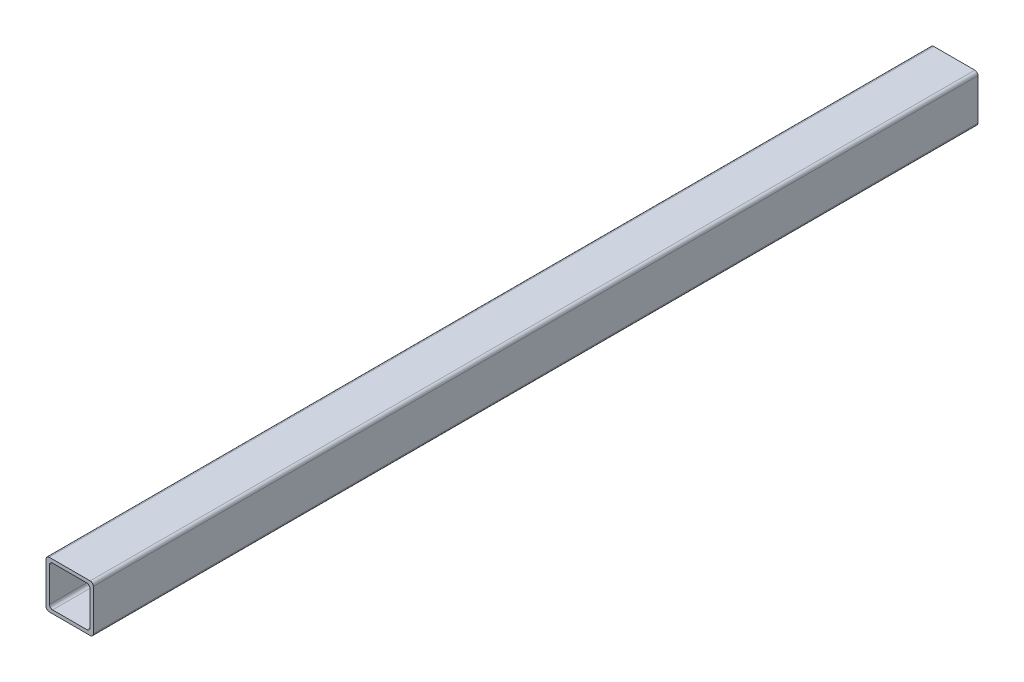
ISO-10303-21;
HEADER;
FILE_DESCRIPTION(('STEP AP214'),'2;1');
FILE_NAME('part.step','',(''),(''),'','','');
FILE_SCHEMA(('AUTOMOTIVE_DESIGN { 1 0 10303 214 1 1 1 1 }'));
ENDSEC;
DATA;
#1=APPLICATION_CONTEXT('core data for automotive mechanical design processes');
#2=APPLICATION_PROTOCOL_DEFINITION('international standard','automotive_design',2000,#1);
#3=PRODUCT_CONTEXT('',#1,'mechanical');
#4=PRODUCT('Part','Part','',(#3));
#5=PRODUCT_RELATED_PRODUCT_CATEGORY('part','',(#4));
#6=PRODUCT_DEFINITION_FORMATION('','',#4);
#7=PRODUCT_DEFINITION_CONTEXT('part definition',#1,'design');
#8=PRODUCT_DEFINITION('design','',#6,#7);
#9=PRODUCT_DEFINITION_SHAPE('','',#8);
#10=(LENGTH_UNIT() NAMED_UNIT(*) SI_UNIT(.MILLI.,.METRE.));
#11=(NAMED_UNIT(*) PLANE_ANGLE_UNIT() SI_UNIT($,.RADIAN.));
#12=(NAMED_UNIT(*) SI_UNIT($,.STERADIAN.) SOLID_ANGLE_UNIT());
#13=UNCERTAINTY_MEASURE_WITH_UNIT(LENGTH_MEASURE(1.E-05),#10,'distance_accuracy_value','');
#14=(GEOMETRIC_REPRESENTATION_CONTEXT(3) GLOBAL_UNCERTAINTY_ASSIGNED_CONTEXT((#13)) GLOBAL_UNIT_ASSIGNED_CONTEXT((#10,
#11,#12)) REPRESENTATION_CONTEXT('',''));
#15=CARTESIAN_POINT('',(0.,0.,0.));
#16=DIRECTION('',(0.,0.,1.));
#17=DIRECTION('',(1.,0.,0.));
#18=AXIS2_PLACEMENT_3D('',#15,#16,#17);
#19=CARTESIAN_POINT('',(2.54,-35.56,0.));
#20=DIRECTION('',(0.,0.,1.));
#21=DIRECTION('',(1.,0.,0.));
#22=AXIS2_PLACEMENT_3D('',#19,#20,#21);
#23=PLANE('',#22);
#24=CARTESIAN_POINT('',(2.54,-35.56,0.));
#25=DIRECTION('',(0.,0.,1.));
#26=DIRECTION('',(1.,0.,0.));
#27=AXIS2_PLACEMENT_3D('',#24,#25,#26);
#28=CIRCLE('',#27,2.54);
#29=CARTESIAN_POINT('',(0.,-35.56,0.));
#30=VERTEX_POINT('',#29);
#31=CARTESIAN_POINT('',(2.54000000000002,-38.1,0.));
#32=VERTEX_POINT('',#31);
#33=EDGE_CURVE('E193',#30,#32,#28,.T.);
#34=ORIENTED_EDGE('',*,*,#33,.F.);
#35=DIRECTION('',(0.,-1.,0.));
#36=VECTOR('',#35,1.);
#37=CARTESIAN_POINT('',(0.,-2.54000000000002,0.));
#38=LINE('',#37,#36);
#39=CARTESIAN_POINT('',(0.,-2.54000000000002,0.));
#40=VERTEX_POINT('',#39);
#41=EDGE_CURVE('E217',#40,#30,#38,.T.);
#42=ORIENTED_EDGE('',*,*,#41,.F.);
#43=CARTESIAN_POINT('',(2.54,-2.54,0.));
#44=DIRECTION('',(0.,0.,1.));
#45=DIRECTION('',(-1.,0.,0.));
#46=AXIS2_PLACEMENT_3D('',#43,#44,#45);
#47=CIRCLE('',#46,2.54);
#48=CARTESIAN_POINT('',(2.54000000000002,0.,0.));
#49=VERTEX_POINT('',#48);
#50=EDGE_CURVE('E214',#49,#40,#47,.T.);
#51=ORIENTED_EDGE('',*,*,#50,.F.);
#52=DIRECTION('',(-1.,0.,0.));
#53=VECTOR('',#52,1.);
#54=CARTESIAN_POINT('',(2.54000000000002,0.,0.));
#55=LINE('',#54,#53);
#56=CARTESIAN_POINT('',(35.56,0.,0.));
#57=VERTEX_POINT('',#56);
#58=EDGE_CURVE('E212',#57,#49,#55,.T.);
#59=ORIENTED_EDGE('',*,*,#58,.F.);
#60=CARTESIAN_POINT('',(35.56,-2.54,0.));
#61=DIRECTION('',(0.,0.,1.));
#62=DIRECTION('',(1.,0.,0.));
#63=AXIS2_PLACEMENT_3D('',#60,#61,#62);
#64=CIRCLE('',#63,2.54);
#65=CARTESIAN_POINT('',(38.1,-2.54000000000002,0.));
#66=VERTEX_POINT('',#65);
#67=EDGE_CURVE('E165',#66,#57,#64,.T.);
#68=ORIENTED_EDGE('',*,*,#67,.F.);
#69=DIRECTION('',(0.,1.,0.));
#70=VECTOR('',#69,1.);
#71=CARTESIAN_POINT('',(38.1,-2.54000000000002,0.));
#72=LINE('',#71,#70);
#73=CARTESIAN_POINT('',(38.1,-35.56,0.));
#74=VERTEX_POINT('',#73);
#75=EDGE_CURVE('E208',#74,#66,#72,.T.);
#76=ORIENTED_EDGE('',*,*,#75,.F.);
#77=CARTESIAN_POINT('',(35.56,-35.56,0.));
#78=DIRECTION('',(0.,0.,1.));
#79=DIRECTION('',(-1.,0.,0.));
#80=AXIS2_PLACEMENT_3D('',#77,#78,#79);
#81=CIRCLE('',#80,2.54);
#82=CARTESIAN_POINT('',(35.56,-38.1,0.));
#83=VERTEX_POINT('',#82);
#84=EDGE_CURVE('E196',#83,#74,#81,.T.);
#85=ORIENTED_EDGE('',*,*,#84,.F.);
#86=DIRECTION('',(1.,0.,0.));
#87=VECTOR('',#86,1.);
#88=CARTESIAN_POINT('',(2.54000000000002,-38.1,0.));
#89=LINE('',#88,#87);
#90=EDGE_CURVE('E184',#32,#83,#89,.T.);
#91=ORIENTED_EDGE('',*,*,#90,.F.);
#92=EDGE_LOOP('',(#34,#42,#51,#59,#68,#76,#85,#91));
#93=FACE_BOUND('',#92,.T.);
#94=CARTESIAN_POINT('',(5.3086,-32.7914,0.));
#95=DIRECTION('',(0.,0.,1.));
#96=DIRECTION('',(1.,0.,0.));
#97=AXIS2_PLACEMENT_3D('',#94,#95,#96);
#98=CIRCLE('',#97,2.54);
#99=CARTESIAN_POINT('',(2.7686,-32.7914,0.));
#100=VERTEX_POINT('',#99);
#101=CARTESIAN_POINT('',(5.30860000000002,-35.3314,0.));
#102=VERTEX_POINT('',#101);
#103=EDGE_CURVE('E234',#100,#102,#98,.T.);
#104=ORIENTED_EDGE('',*,*,#103,.T.);
#105=DIRECTION('',(1.,0.,0.));
#106=VECTOR('',#105,1.);
#107=CARTESIAN_POINT('',(5.30860000000002,-35.3314,0.));
#108=LINE('',#107,#106);
#109=CARTESIAN_POINT('',(32.7914,-35.3314,0.));
#110=VERTEX_POINT('',#109);
#111=EDGE_CURVE('E240',#102,#110,#108,.T.);
#112=ORIENTED_EDGE('',*,*,#111,.T.);
#113=CARTESIAN_POINT('',(32.7914,-32.7914,0.));
#114=DIRECTION('',(0.,0.,1.));
#115=DIRECTION('',(1.,0.,0.));
#116=AXIS2_PLACEMENT_3D('',#113,#114,#115);
#117=CIRCLE('',#116,2.54);
#118=CARTESIAN_POINT('',(35.3314,-32.7914,0.));
#119=VERTEX_POINT('',#118);
#120=EDGE_CURVE('E243',#110,#119,#117,.T.);
#121=ORIENTED_EDGE('',*,*,#120,.T.);
#122=DIRECTION('',(0.,1.,0.));
#123=VECTOR('',#122,1.);
#124=CARTESIAN_POINT('',(35.3314,-5.30860000000002,0.));
#125=LINE('',#124,#123);
#126=CARTESIAN_POINT('',(35.3314,-5.30860000000002,0.));
#127=VERTEX_POINT('',#126);
#128=EDGE_CURVE('E246',#119,#127,#125,.T.);
#129=ORIENTED_EDGE('',*,*,#128,.T.);
#130=CARTESIAN_POINT('',(32.7914,-5.3086,0.));
#131=DIRECTION('',(0.,0.,1.));
#132=DIRECTION('',(1.,0.,0.));
#133=AXIS2_PLACEMENT_3D('',#130,#131,#132);
#134=CIRCLE('',#133,2.54);
#135=CARTESIAN_POINT('',(32.7914,-2.7686,0.));
#136=VERTEX_POINT('',#135);
#137=EDGE_CURVE('E249',#127,#136,#134,.T.);
#138=ORIENTED_EDGE('',*,*,#137,.T.);
#139=DIRECTION('',(-1.,0.,0.));
#140=VECTOR('',#139,1.);
#141=CARTESIAN_POINT('',(5.30860000000002,-2.7686,0.));
#142=LINE('',#141,#140);
#143=CARTESIAN_POINT('',(5.30860000000002,-2.7686,0.));
#144=VERTEX_POINT('',#143);
#145=EDGE_CURVE('E252',#136,#144,#142,.T.);
#146=ORIENTED_EDGE('',*,*,#145,.T.);
#147=CARTESIAN_POINT('',(5.3086,-5.3086,0.));
#148=DIRECTION('',(0.,0.,1.));
#149=DIRECTION('',(1.,0.,0.));
#150=AXIS2_PLACEMENT_3D('',#147,#148,#149);
#151=CIRCLE('',#150,2.54);
#152=CARTESIAN_POINT('',(2.7686,-5.30860000000002,0.));
#153=VERTEX_POINT('',#152);
#154=EDGE_CURVE('E255',#144,#153,#151,.T.);
#155=ORIENTED_EDGE('',*,*,#154,.T.);
#156=DIRECTION('',(0.,-1.,0.));
#157=VECTOR('',#156,1.);
#158=CARTESIAN_POINT('',(2.7686,-5.30860000000002,0.));
#159=LINE('',#158,#157);
#160=EDGE_CURVE('E258',#153,#100,#159,.T.);
#161=ORIENTED_EDGE('',*,*,#160,.T.);
#162=EDGE_LOOP('',(#104,#112,#121,#129,#138,#146,#155,#161));
#163=FACE_BOUND('',#162,.T.);
#164=ADVANCED_FACE('F33',(#93,#163),#23,.F.);
#165=CARTESIAN_POINT('',(2.54,-35.56,737.));
#166=DIRECTION('',(0.,0.,-1.));
#167=DIRECTION('',(-1.,0.,0.));
#168=AXIS2_PLACEMENT_3D('',#165,#166,#167);
#169=CYLINDRICAL_SURFACE('',#168,2.54);
#170=DIRECTION('',(0.,0.,-1.));
#171=VECTOR('',#170,1.);
#172=CARTESIAN_POINT('',(2.54000000000002,-38.1,737.));
#173=LINE('',#172,#171);
#174=CARTESIAN_POINT('',(2.54000000000002,-38.1,711.899999999977));
#175=VERTEX_POINT('',#174);
#176=EDGE_CURVE('E41',#175,#32,#173,.T.);
#177=ORIENTED_EDGE('',*,*,#176,.F.);
#178=CARTESIAN_POINT('',(2.54,-35.56,711.899999999977));
#179=DIRECTION('',(0.,0.,-1.));
#180=DIRECTION('',(-1.,0.,0.));
#181=AXIS2_PLACEMENT_3D('',#178,#179,#180);
#182=CIRCLE('',#181,2.54);
#183=CARTESIAN_POINT('',(0.,-35.56,711.899999999977));
#184=VERTEX_POINT('',#183);
#185=EDGE_CURVE('E232',#175,#184,#182,.T.);
#186=ORIENTED_EDGE('',*,*,#185,.T.);
#187=DIRECTION('',(0.,0.,-1.));
#188=VECTOR('',#187,1.);
#189=CARTESIAN_POINT('',(0.,-35.56,737.));
#190=LINE('',#189,#188);
#191=EDGE_CURVE('E199',#184,#30,#190,.T.);
#192=ORIENTED_EDGE('',*,*,#191,.T.);
#193=ORIENTED_EDGE('',*,*,#33,.T.);
#194=EDGE_LOOP('',(#177,#186,#192,#193));
#195=FACE_BOUND('',#194,.T.);
#196=ADVANCED_FACE('F35',(#195),#169,.T.);
#197=CARTESIAN_POINT('',(2.54000000000002,-38.1,737.));
#198=DIRECTION('',(0.,1.,0.));
#199=DIRECTION('',(0.,0.,1.));
#200=AXIS2_PLACEMENT_3D('',#197,#198,#199);
#201=PLANE('',#200);
#202=DIRECTION('',(0.,0.,-1.));
#203=VECTOR('',#202,1.);
#204=CARTESIAN_POINT('',(35.56,-38.1,737.));
#205=LINE('',#204,#203);
#206=CARTESIAN_POINT('',(35.56,-38.1,711.899999999977));
#207=VERTEX_POINT('',#206);
#208=EDGE_CURVE('E176',#207,#83,#205,.T.);
#209=ORIENTED_EDGE('',*,*,#208,.F.);
#210=DIRECTION('',(-1.,0.,0.));
#211=VECTOR('',#210,1.);
#212=CARTESIAN_POINT('',(0.,-38.1,711.899999999977));
#213=LINE('',#212,#211);
#214=EDGE_CURVE('E161',#207,#175,#213,.T.);
#215=ORIENTED_EDGE('',*,*,#214,.T.);
#216=ORIENTED_EDGE('',*,*,#176,.T.);
#217=ORIENTED_EDGE('',*,*,#90,.T.);
#218=EDGE_LOOP('',(#209,#215,#216,#217));
#219=FACE_BOUND('',#218,.T.);
#220=ADVANCED_FACE('F183',(#219),#201,.F.);
#221=CARTESIAN_POINT('',(35.56,-35.56,737.));
#222=DIRECTION('',(0.,0.,-1.));
#223=DIRECTION('',(-1.,0.,0.));
#224=AXIS2_PLACEMENT_3D('',#221,#222,#223);
#225=CYLINDRICAL_SURFACE('',#224,2.54);
#226=DIRECTION('',(0.,0.,-1.));
#227=VECTOR('',#226,1.);
#228=CARTESIAN_POINT('',(38.1,-35.56,737.));
#229=LINE('',#228,#227);
#230=CARTESIAN_POINT('',(38.1,-35.56,711.899999999977));
#231=VERTEX_POINT('',#230);
#232=EDGE_CURVE('E169',#231,#74,#229,.T.);
#233=ORIENTED_EDGE('',*,*,#232,.F.);
#234=CARTESIAN_POINT('',(35.56,-35.56,711.899999999977));
#235=DIRECTION('',(0.,0.,-1.));
#236=DIRECTION('',(-1.,0.,0.));
#237=AXIS2_PLACEMENT_3D('',#234,#235,#236);
#238=CIRCLE('',#237,2.54);
#239=EDGE_CURVE('E152',#231,#207,#238,.T.);
#240=ORIENTED_EDGE('',*,*,#239,.T.);
#241=ORIENTED_EDGE('',*,*,#208,.T.);
#242=ORIENTED_EDGE('',*,*,#84,.T.);
#243=EDGE_LOOP('',(#233,#240,#241,#242));
#244=FACE_BOUND('',#243,.T.);
#245=ADVANCED_FACE('F231',(#244),#225,.T.);
#246=CARTESIAN_POINT('',(38.1,-2.54000000000002,737.));
#247=DIRECTION('',(-1.,0.,0.));
#248=DIRECTION('',(0.,-1.,0.));
#249=AXIS2_PLACEMENT_3D('',#246,#247,#248);
#250=PLANE('',#249);
#251=DIRECTION('',(0.,0.,-1.));
#252=VECTOR('',#251,1.);
#253=CARTESIAN_POINT('',(38.1,-2.54000000000002,737.));
#254=LINE('',#253,#252);
#255=CARTESIAN_POINT('',(38.1,-2.54000000000001,711.899999999977));
#256=VERTEX_POINT('',#255);
#257=EDGE_CURVE('E167',#256,#66,#254,.T.);
#258=ORIENTED_EDGE('',*,*,#257,.F.);
#259=DIRECTION('',(0.,1.,0.));
#260=VECTOR('',#259,1.);
#261=CARTESIAN_POINT('',(38.1,-38.1,711.899999999977));
#262=LINE('',#261,#260);
#263=EDGE_CURVE('E148',#231,#256,#262,.T.);
#264=ORIENTED_EDGE('',*,*,#263,.F.);
#265=ORIENTED_EDGE('',*,*,#232,.T.);
#266=ORIENTED_EDGE('',*,*,#75,.T.);
#267=EDGE_LOOP('',(#258,#264,#265,#266));
#268=FACE_BOUND('',#267,.T.);
#269=ADVANCED_FACE('F227',(#268),#250,.F.);
#270=CARTESIAN_POINT('',(35.56,-2.54,737.));
#271=DIRECTION('',(0.,0.,-1.));
#272=DIRECTION('',(-1.,0.,0.));
#273=AXIS2_PLACEMENT_3D('',#270,#271,#272);
#274=CYLINDRICAL_SURFACE('',#273,2.54);
#275=DIRECTION('',(0.,0.,-1.));
#276=VECTOR('',#275,1.);
#277=CARTESIAN_POINT('',(35.56,0.,737.));
#278=LINE('',#277,#276);
#279=CARTESIAN_POINT('',(35.56,0.,711.899999999977));
#280=VERTEX_POINT('',#279);
#281=EDGE_CURVE('E158',#280,#57,#278,.T.);
#282=ORIENTED_EDGE('',*,*,#281,.F.);
#283=CARTESIAN_POINT('',(35.56,-2.54,711.899999999977));
#284=DIRECTION('',(0.,0.,-1.));
#285=DIRECTION('',(-1.,0.,0.));
#286=AXIS2_PLACEMENT_3D('',#283,#284,#285);
#287=CIRCLE('',#286,2.54);
#288=EDGE_CURVE('E143',#280,#256,#287,.T.);
#289=ORIENTED_EDGE('',*,*,#288,.T.);
#290=ORIENTED_EDGE('',*,*,#257,.T.);
#291=ORIENTED_EDGE('',*,*,#67,.T.);
#292=EDGE_LOOP('',(#282,#289,#290,#291));
#293=FACE_BOUND('',#292,.T.);
#294=ADVANCED_FACE('F163',(#293),#274,.T.);
#295=CARTESIAN_POINT('',(2.54000000000002,0.,737.));
#296=DIRECTION('',(0.,-1.,0.));
#297=DIRECTION('',(0.,0.,-1.));
#298=AXIS2_PLACEMENT_3D('',#295,#296,#297);
#299=PLANE('',#298);
#300=DIRECTION('',(0.,0.,-1.));
#301=VECTOR('',#300,1.);
#302=CARTESIAN_POINT('',(2.54000000000002,0.,737.));
#303=LINE('',#302,#301);
#304=CARTESIAN_POINT('',(2.54,0.,711.899999999977));
#305=VERTEX_POINT('',#304);
#306=EDGE_CURVE('E160',#305,#49,#303,.T.);
#307=ORIENTED_EDGE('',*,*,#306,.F.);
#308=DIRECTION('',(-1.,0.,0.));
#309=VECTOR('',#308,1.);
#310=CARTESIAN_POINT('',(0.,0.,711.899999999977));
#311=LINE('',#310,#309);
#312=EDGE_CURVE('E146',#280,#305,#311,.T.);
#313=ORIENTED_EDGE('',*,*,#312,.F.);
#314=ORIENTED_EDGE('',*,*,#281,.T.);
#315=ORIENTED_EDGE('',*,*,#58,.T.);
#316=EDGE_LOOP('',(#307,#313,#314,#315));
#317=FACE_BOUND('',#316,.T.);
#318=ADVANCED_FACE('F156',(#317),#299,.F.);
#319=CARTESIAN_POINT('',(2.54,-2.54,737.));
#320=DIRECTION('',(0.,0.,-1.));
#321=DIRECTION('',(-1.,0.,0.));
#322=AXIS2_PLACEMENT_3D('',#319,#320,#321);
#323=CYLINDRICAL_SURFACE('',#322,2.54);
#324=DIRECTION('',(0.,0.,-1.));
#325=VECTOR('',#324,1.);
#326=CARTESIAN_POINT('',(0.,-2.54000000000002,737.));
#327=LINE('',#326,#325);
#328=CARTESIAN_POINT('',(0.,-2.54000000000002,711.899999999977));
#329=VERTEX_POINT('',#328);
#330=EDGE_CURVE('E171',#329,#40,#327,.T.);
#331=ORIENTED_EDGE('',*,*,#330,.F.);
#332=CARTESIAN_POINT('',(2.54,-2.54,711.899999999977));
#333=DIRECTION('',(0.,0.,-1.));
#334=DIRECTION('',(-1.,0.,0.));
#335=AXIS2_PLACEMENT_3D('',#332,#333,#334);
#336=CIRCLE('',#335,2.54);
#337=EDGE_CURVE('E48',#329,#305,#336,.T.);
#338=ORIENTED_EDGE('',*,*,#337,.T.);
#339=ORIENTED_EDGE('',*,*,#306,.T.);
#340=ORIENTED_EDGE('',*,*,#50,.T.);
#341=EDGE_LOOP('',(#331,#338,#339,#340));
#342=FACE_BOUND('',#341,.T.);
#343=ADVANCED_FACE('F225',(#342),#323,.T.);
#344=CARTESIAN_POINT('',(0.,-2.54000000000002,737.));
#345=DIRECTION('',(1.,0.,0.));
#346=DIRECTION('',(0.,1.,0.));
#347=AXIS2_PLACEMENT_3D('',#344,#345,#346);
#348=PLANE('',#347);
#349=ORIENTED_EDGE('',*,*,#191,.F.);
#350=DIRECTION('',(0.,1.,0.));
#351=VECTOR('',#350,1.);
#352=CARTESIAN_POINT('',(0.,-38.1,711.899999999977));
#353=LINE('',#352,#351);
#354=EDGE_CURVE('E222',#184,#329,#353,.T.);
#355=ORIENTED_EDGE('',*,*,#354,.T.);
#356=ORIENTED_EDGE('',*,*,#330,.T.);
#357=ORIENTED_EDGE('',*,*,#41,.T.);
#358=EDGE_LOOP('',(#349,#355,#356,#357));
#359=FACE_BOUND('',#358,.T.);
#360=ADVANCED_FACE('F221',(#359),#348,.F.);
#361=CARTESIAN_POINT('',(5.3086,-32.7914,737.));
#362=DIRECTION('',(0.,0.,-1.));
#363=DIRECTION('',(-1.,0.,0.));
#364=AXIS2_PLACEMENT_3D('',#361,#362,#363);
#365=CYLINDRICAL_SURFACE('',#364,2.54);
#366=CARTESIAN_POINT('',(5.3086,-32.7914,711.899999999977));
#367=DIRECTION('',(0.,0.,-1.));
#368=DIRECTION('',(-1.,0.,0.));
#369=AXIS2_PLACEMENT_3D('',#366,#367,#368);
#370=CIRCLE('',#369,2.54);
#371=CARTESIAN_POINT('',(5.30860000000002,-35.3314,711.899999999977));
#372=VERTEX_POINT('',#371);
#373=CARTESIAN_POINT('',(2.7686,-32.7914,711.899999999977));
#374=VERTEX_POINT('',#373);
#375=EDGE_CURVE('E55',#372,#374,#370,.T.);
#376=ORIENTED_EDGE('',*,*,#375,.F.);
#377=DIRECTION('',(0.,0.,-1.));
#378=VECTOR('',#377,1.);
#379=CARTESIAN_POINT('',(5.30860000000002,-35.3314,737.));
#380=LINE('',#379,#378);
#381=EDGE_CURVE('E201',#372,#102,#380,.T.);
#382=ORIENTED_EDGE('',*,*,#381,.T.);
#383=ORIENTED_EDGE('',*,*,#103,.F.);
#384=DIRECTION('',(0.,0.,-1.));
#385=VECTOR('',#384,1.);
#386=CARTESIAN_POINT('',(2.7686,-32.7914,737.));
#387=LINE('',#386,#385);
#388=EDGE_CURVE('E261',#374,#100,#387,.T.);
#389=ORIENTED_EDGE('',*,*,#388,.F.);
#390=EDGE_LOOP('',(#376,#382,#383,#389));
#391=FACE_BOUND('',#390,.T.);
#392=ADVANCED_FACE('F289',(#391),#365,.F.);
#393=CARTESIAN_POINT('',(5.30860000000002,-35.3314,737.));
#394=DIRECTION('',(0.,1.,0.));
#395=DIRECTION('',(0.,0.,1.));
#396=AXIS2_PLACEMENT_3D('',#393,#394,#395);
#397=PLANE('',#396);
#398=DIRECTION('',(-1.,0.,0.));
#399=VECTOR('',#398,1.);
#400=CARTESIAN_POINT('',(5.30860000000002,-35.3314,711.899999999977));
#401=LINE('',#400,#399);
#402=CARTESIAN_POINT('',(32.7914,-35.3314,711.899999999977));
#403=VERTEX_POINT('',#402);
#404=EDGE_CURVE('E279',#403,#372,#401,.T.);
#405=ORIENTED_EDGE('',*,*,#404,.F.);
#406=DIRECTION('',(0.,0.,-1.));
#407=VECTOR('',#406,1.);
#408=CARTESIAN_POINT('',(32.7914,-35.3314,737.));
#409=LINE('',#408,#407);
#410=EDGE_CURVE('E203',#403,#110,#409,.T.);
#411=ORIENTED_EDGE('',*,*,#410,.T.);
#412=ORIENTED_EDGE('',*,*,#111,.F.);
#413=ORIENTED_EDGE('',*,*,#381,.F.);
#414=EDGE_LOOP('',(#405,#411,#412,#413));
#415=FACE_BOUND('',#414,.T.);
#416=ADVANCED_FACE('F277',(#415),#397,.T.);
#417=CARTESIAN_POINT('',(32.7914,-32.7914,737.));
#418=DIRECTION('',(0.,0.,-1.));
#419=DIRECTION('',(-1.,0.,0.));
#420=AXIS2_PLACEMENT_3D('',#417,#418,#419);
#421=CYLINDRICAL_SURFACE('',#420,2.54);
#422=CARTESIAN_POINT('',(32.7914,-32.7914,711.899999999977));
#423=DIRECTION('',(0.,0.,-1.));
#424=DIRECTION('',(-1.,0.,0.));
#425=AXIS2_PLACEMENT_3D('',#422,#423,#424);
#426=CIRCLE('',#425,2.54);
#427=CARTESIAN_POINT('',(35.3314,-32.7914,711.899999999977));
#428=VERTEX_POINT('',#427);
#429=EDGE_CURVE('E291',#428,#403,#426,.T.);
#430=ORIENTED_EDGE('',*,*,#429,.F.);
#431=DIRECTION('',(0.,0.,-1.));
#432=VECTOR('',#431,1.);
#433=CARTESIAN_POINT('',(35.3314,-32.7914,737.));
#434=LINE('',#433,#432);
#435=EDGE_CURVE('E271',#428,#119,#434,.T.);
#436=ORIENTED_EDGE('',*,*,#435,.T.);
#437=ORIENTED_EDGE('',*,*,#120,.F.);
#438=ORIENTED_EDGE('',*,*,#410,.F.);
#439=EDGE_LOOP('',(#430,#436,#437,#438));
#440=FACE_BOUND('',#439,.T.);
#441=ADVANCED_FACE('F282',(#440),#421,.F.);
#442=CARTESIAN_POINT('',(35.3314,-5.30860000000002,737.));
#443=DIRECTION('',(-1.,0.,0.));
#444=DIRECTION('',(0.,0.,1.));
#445=AXIS2_PLACEMENT_3D('',#442,#443,#444);
#446=PLANE('',#445);
#447=DIRECTION('',(0.,-1.,0.));
#448=VECTOR('',#447,1.);
#449=CARTESIAN_POINT('',(35.3314,-5.30860000000002,711.899999999977));
#450=LINE('',#449,#448);
#451=CARTESIAN_POINT('',(35.3314,-5.30860000000002,711.899999999977));
#452=VERTEX_POINT('',#451);
#453=EDGE_CURVE('E295',#452,#428,#450,.T.);
#454=ORIENTED_EDGE('',*,*,#453,.F.);
#455=DIRECTION('',(0.,0.,-1.));
#456=VECTOR('',#455,1.);
#457=CARTESIAN_POINT('',(35.3314,-5.30860000000002,737.));
#458=LINE('',#457,#456);
#459=EDGE_CURVE('E269',#452,#127,#458,.T.);
#460=ORIENTED_EDGE('',*,*,#459,.T.);
#461=ORIENTED_EDGE('',*,*,#128,.F.);
#462=ORIENTED_EDGE('',*,*,#435,.F.);
#463=EDGE_LOOP('',(#454,#460,#461,#462));
#464=FACE_BOUND('',#463,.T.);
#465=ADVANCED_FACE('F323',(#464),#446,.T.);
#466=CARTESIAN_POINT('',(32.7914,-5.3086,737.));
#467=DIRECTION('',(0.,0.,-1.));
#468=DIRECTION('',(-1.,0.,0.));
#469=AXIS2_PLACEMENT_3D('',#466,#467,#468);
#470=CYLINDRICAL_SURFACE('',#469,2.54);
#471=CARTESIAN_POINT('',(32.7914,-5.3086,711.899999999977));
#472=DIRECTION('',(0.,0.,-1.));
#473=DIRECTION('',(-1.,0.,0.));
#474=AXIS2_PLACEMENT_3D('',#471,#472,#473);
#475=CIRCLE('',#474,2.54);
#476=CARTESIAN_POINT('',(32.7914,-2.7686,711.899999999977));
#477=VERTEX_POINT('',#476);
#478=EDGE_CURVE('E297',#477,#452,#475,.T.);
#479=ORIENTED_EDGE('',*,*,#478,.F.);
#480=DIRECTION('',(0.,0.,-1.));
#481=VECTOR('',#480,1.);
#482=CARTESIAN_POINT('',(32.7914,-2.7686,737.));
#483=LINE('',#482,#481);
#484=EDGE_CURVE('E267',#477,#136,#483,.T.);
#485=ORIENTED_EDGE('',*,*,#484,.T.);
#486=ORIENTED_EDGE('',*,*,#137,.F.);
#487=ORIENTED_EDGE('',*,*,#459,.F.);
#488=EDGE_LOOP('',(#479,#485,#486,#487));
#489=FACE_BOUND('',#488,.T.);
#490=ADVANCED_FACE('F320',(#489),#470,.F.);
#491=CARTESIAN_POINT('',(5.30860000000002,-2.7686,737.));
#492=DIRECTION('',(0.,-1.,0.));
#493=DIRECTION('',(0.,0.,-1.));
#494=AXIS2_PLACEMENT_3D('',#491,#492,#493);
#495=PLANE('',#494);
#496=DIRECTION('',(1.,0.,0.));
#497=VECTOR('',#496,1.);
#498=CARTESIAN_POINT('',(5.30860000000002,-2.7686,711.899999999977));
#499=LINE('',#498,#497);
#500=CARTESIAN_POINT('',(5.30860000000002,-2.7686,711.899999999977));
#501=VERTEX_POINT('',#500);
#502=EDGE_CURVE('E299',#501,#477,#499,.T.);
#503=ORIENTED_EDGE('',*,*,#502,.F.);
#504=DIRECTION('',(0.,0.,-1.));
#505=VECTOR('',#504,1.);
#506=CARTESIAN_POINT('',(5.30860000000002,-2.7686,737.));
#507=LINE('',#506,#505);
#508=EDGE_CURVE('E265',#501,#144,#507,.T.);
#509=ORIENTED_EDGE('',*,*,#508,.T.);
#510=ORIENTED_EDGE('',*,*,#145,.F.);
#511=ORIENTED_EDGE('',*,*,#484,.F.);
#512=EDGE_LOOP('',(#503,#509,#510,#511));
#513=FACE_BOUND('',#512,.T.);
#514=ADVANCED_FACE('F313',(#513),#495,.T.);
#515=CARTESIAN_POINT('',(5.3086,-5.3086,737.));
#516=DIRECTION('',(0.,0.,-1.));
#517=DIRECTION('',(-1.,0.,0.));
#518=AXIS2_PLACEMENT_3D('',#515,#516,#517);
#519=CYLINDRICAL_SURFACE('',#518,2.54);
#520=CARTESIAN_POINT('',(5.3086,-5.3086,711.899999999977));
#521=DIRECTION('',(0.,0.,-1.));
#522=DIRECTION('',(-1.,0.,0.));
#523=AXIS2_PLACEMENT_3D('',#520,#521,#522);
#524=CIRCLE('',#523,2.54);
#525=CARTESIAN_POINT('',(2.7686,-5.30860000000002,711.899999999977));
#526=VERTEX_POINT('',#525);
#527=EDGE_CURVE('E301',#526,#501,#524,.T.);
#528=ORIENTED_EDGE('',*,*,#527,.F.);
#529=DIRECTION('',(0.,0.,-1.));
#530=VECTOR('',#529,1.);
#531=CARTESIAN_POINT('',(2.7686,-5.30860000000002,737.));
#532=LINE('',#531,#530);
#533=EDGE_CURVE('E263',#526,#153,#532,.T.);
#534=ORIENTED_EDGE('',*,*,#533,.T.);
#535=ORIENTED_EDGE('',*,*,#154,.F.);
#536=ORIENTED_EDGE('',*,*,#508,.F.);
#537=EDGE_LOOP('',(#528,#534,#535,#536));
#538=FACE_BOUND('',#537,.T.);
#539=ADVANCED_FACE('F316',(#538),#519,.F.);
#540=CARTESIAN_POINT('',(2.7686,-5.30860000000002,737.));
#541=DIRECTION('',(1.,0.,0.));
#542=DIRECTION('',(0.,0.,-1.));
#543=AXIS2_PLACEMENT_3D('',#540,#541,#542);
#544=PLANE('',#543);
#545=DIRECTION('',(0.,1.,0.));
#546=VECTOR('',#545,1.);
#547=CARTESIAN_POINT('',(2.7686,-5.30860000000002,711.899999999977));
#548=LINE('',#547,#546);
#549=EDGE_CURVE('E11',#374,#526,#548,.T.);
#550=ORIENTED_EDGE('',*,*,#549,.F.);
#551=ORIENTED_EDGE('',*,*,#388,.T.);
#552=ORIENTED_EDGE('',*,*,#160,.F.);
#553=ORIENTED_EDGE('',*,*,#533,.F.);
#554=EDGE_LOOP('',(#550,#551,#552,#553));
#555=FACE_BOUND('',#554,.T.);
#556=ADVANCED_FACE('F421',(#555),#544,.T.);
#557=CARTESIAN_POINT('',(0.,-38.1,711.899999999977));
#558=DIRECTION('',(0.,0.,-1.));
#559=DIRECTION('',(-1.,0.,0.));
#560=AXIS2_PLACEMENT_3D('',#557,#558,#559);
#561=PLANE('',#560);
#562=ORIENTED_EDGE('',*,*,#375,.T.);
#563=ORIENTED_EDGE('',*,*,#549,.T.);
#564=ORIENTED_EDGE('',*,*,#527,.T.);
#565=ORIENTED_EDGE('',*,*,#502,.T.);
#566=ORIENTED_EDGE('',*,*,#478,.T.);
#567=ORIENTED_EDGE('',*,*,#453,.T.);
#568=ORIENTED_EDGE('',*,*,#429,.T.);
#569=ORIENTED_EDGE('',*,*,#404,.T.);
#570=EDGE_LOOP('',(#562,#563,#564,#565,#566,#567,#568,#569));
#571=FACE_BOUND('',#570,.T.);
#572=ORIENTED_EDGE('',*,*,#214,.F.);
#573=ORIENTED_EDGE('',*,*,#239,.F.);
#574=ORIENTED_EDGE('',*,*,#263,.T.);
#575=ORIENTED_EDGE('',*,*,#288,.F.);
#576=ORIENTED_EDGE('',*,*,#312,.T.);
#577=ORIENTED_EDGE('',*,*,#337,.F.);
#578=ORIENTED_EDGE('',*,*,#354,.F.);
#579=ORIENTED_EDGE('',*,*,#185,.F.);
#580=EDGE_LOOP('',(#572,#573,#574,#575,#576,#577,#578,#579));
#581=FACE_BOUND('',#580,.T.);
#582=ADVANCED_FACE('F145',(#571,#581),#561,.F.);
#583=CLOSED_SHELL('',(#164,#196,#220,#245,#269,#294,#318,#343,#360,#392,#416,#441,#465,#490,
#514,#539,#556,#582));
#584=MANIFOLD_SOLID_BREP('B2',#583);
#585=ADVANCED_BREP_SHAPE_REPRESENTATION('',(#18,#584),#14);
#586=SHAPE_DEFINITION_REPRESENTATION(#9,#585);
ENDSEC;
END-ISO-10303-21;
